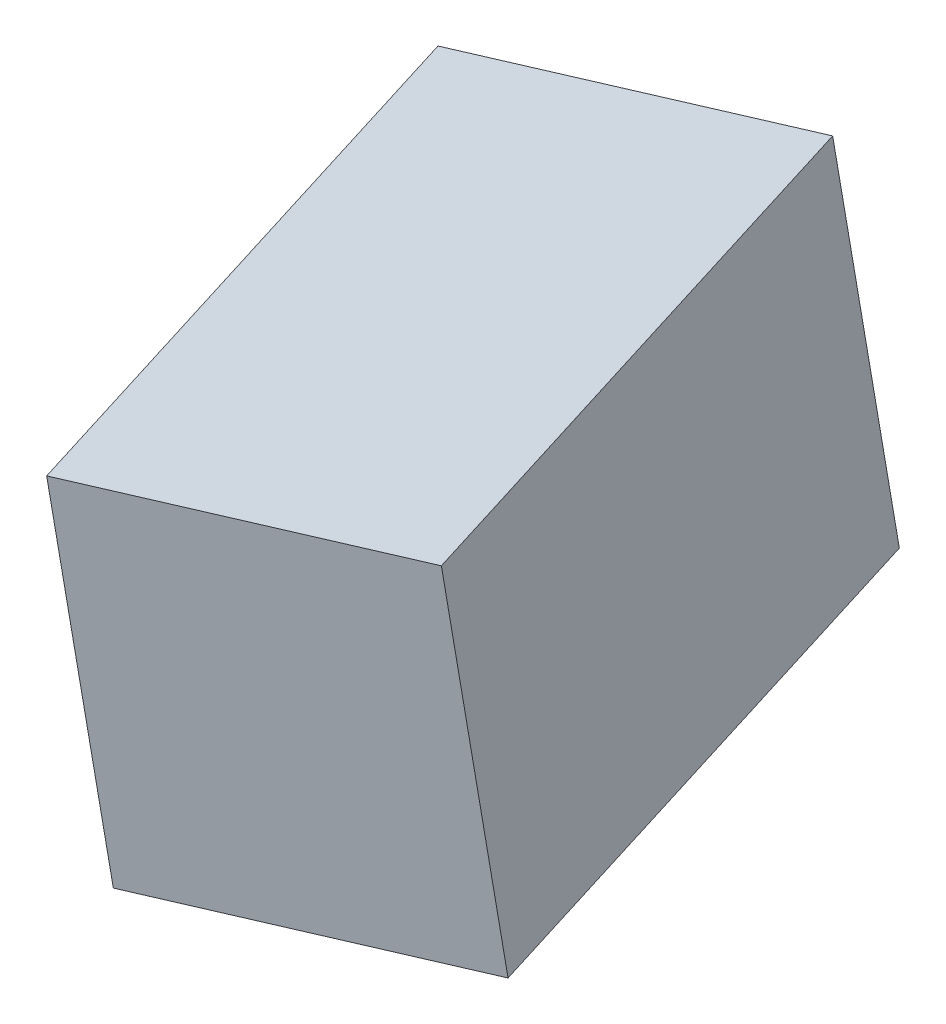
ISO-10303-21;
HEADER;
FILE_DESCRIPTION(('STEP AP214'),'2;1');
FILE_NAME('part.step','',(''),(''),'','','');
FILE_SCHEMA(('AUTOMOTIVE_DESIGN { 1 0 10303 214 1 1 1 1 }'));
ENDSEC;
DATA;
#1=APPLICATION_CONTEXT('core data for automotive mechanical design processes');
#2=APPLICATION_PROTOCOL_DEFINITION('international standard','automotive_design',2000,#1);
#3=PRODUCT_CONTEXT('',#1,'mechanical');
#4=PRODUCT('Part','Part','',(#3));
#5=PRODUCT_RELATED_PRODUCT_CATEGORY('part','',(#4));
#6=PRODUCT_DEFINITION_FORMATION('','',#4);
#7=PRODUCT_DEFINITION_CONTEXT('part definition',#1,'design');
#8=PRODUCT_DEFINITION('design','',#6,#7);
#9=PRODUCT_DEFINITION_SHAPE('','',#8);
#10=(LENGTH_UNIT() NAMED_UNIT(*) SI_UNIT(.MILLI.,.METRE.));
#11=(NAMED_UNIT(*) PLANE_ANGLE_UNIT() SI_UNIT($,.RADIAN.));
#12=(NAMED_UNIT(*) SI_UNIT($,.STERADIAN.) SOLID_ANGLE_UNIT());
#13=UNCERTAINTY_MEASURE_WITH_UNIT(LENGTH_MEASURE(1.E-05),#10,'distance_accuracy_value','');
#14=(GEOMETRIC_REPRESENTATION_CONTEXT(3) GLOBAL_UNCERTAINTY_ASSIGNED_CONTEXT((#13)) GLOBAL_UNIT_ASSIGNED_CONTEXT((#10,
#11,#12)) REPRESENTATION_CONTEXT('',''));
#15=CARTESIAN_POINT('',(0.,0.,0.));
#16=DIRECTION('',(0.,0.,1.));
#17=DIRECTION('',(1.,0.,0.));
#18=AXIS2_PLACEMENT_3D('',#15,#16,#17);
#19=CARTESIAN_POINT('',(-1947.6709022965,350.009766664915,98.4716917595155));
#20=DIRECTION('',(-0.097384757663106,0.9913004955533,0.0885411570439388));
#21=DIRECTION('',(-0.995209160420896,-0.0977687425220106,0.));
#22=AXIS2_PLACEMENT_3D('',#19,#20,#21);
#23=PLANE('',#22);
#24=DIRECTION('',(-0.258011828042799,0.0607761898211663,-0.96422826723802));
#25=VECTOR('',#24,1.);
#26=CARTESIAN_POINT('',(-1995.73195996185,344.172476568774,110.964120683516));
#27=LINE('',#26,#25);
#28=CARTESIAN_POINT('',(-1973.80095457821,339.006500433975,192.923523398748));
#29=VERTEX_POINT('',#28);
#30=CARTESIAN_POINT('',(-1995.73195996185,344.172476568774,110.964120683516));
#31=VERTEX_POINT('',#30);
#32=EDGE_CURVE('E102',#29,#31,#27,.T.);
#33=ORIENTED_EDGE('',*,*,#32,.T.);
#34=DIRECTION('',(-0.961221153307038,-0.116745801922822,0.249848578480018));
#35=VECTOR('',#34,1.);
#36=CARTESIAN_POINT('',(-1947.6709022965,350.009766664915,98.4716917595155));
#37=LINE('',#36,#35);
#38=CARTESIAN_POINT('',(-1947.6709022965,350.009766664915,98.4716917595155));
#39=VERTEX_POINT('',#38);
#40=EDGE_CURVE('E11',#39,#31,#37,.T.);
#41=ORIENTED_EDGE('',*,*,#40,.F.);
#42=DIRECTION('',(-0.258011828042799,0.0607761898211663,-0.96422826723802));
#43=VECTOR('',#42,1.);
#44=CARTESIAN_POINT('',(-1947.6709022965,350.009766664915,98.4716917595155));
#45=LINE('',#44,#43);
#46=CARTESIAN_POINT('',(-1925.73989691286,344.843790530116,180.431094474747));
#47=VERTEX_POINT('',#46);
#48=EDGE_CURVE('E90',#47,#39,#45,.T.);
#49=ORIENTED_EDGE('',*,*,#48,.F.);
#50=DIRECTION('',(-0.961221153307038,-0.116745801922822,0.249848578480018));
#51=VECTOR('',#50,1.);
#52=CARTESIAN_POINT('',(-1925.73989691286,344.843790530116,180.431094474747));
#53=LINE('',#52,#51);
#54=EDGE_CURVE('E98',#47,#29,#53,.T.);
#55=ORIENTED_EDGE('',*,*,#54,.T.);
#56=EDGE_LOOP('',(#33,#41,#49,#55));
#57=FACE_BOUND('',#56,.T.);
#58=ADVANCED_FACE('F39',(#57),#23,.F.);
#59=CARTESIAN_POINT('',(-1947.6709022965,350.009766664915,98.4716917595155));
#60=DIRECTION('',(0.258011828042799,-0.060776189821167,0.96422826723802));
#61=DIRECTION('',(0.966014022648404,0.,-0.25848966719513));
#62=AXIS2_PLACEMENT_3D('',#59,#60,#61);
#63=PLANE('',#62);
#64=DIRECTION('',(-0.0973847576631013,0.991300495553301,0.0885411570439383));
#65=VECTOR('',#64,1.);
#66=CARTESIAN_POINT('',(-1995.73195996185,344.172476568774,110.964120683516));
#67=LINE('',#66,#65);
#68=CARTESIAN_POINT('',(-2001.08812163332,398.694003824206,115.833884320933));
#69=VERTEX_POINT('',#68);
#70=EDGE_CURVE('E94',#31,#69,#67,.T.);
#71=ORIENTED_EDGE('',*,*,#70,.T.);
#72=DIRECTION('',(-0.961221153307038,-0.116745801922822,0.249848578480018));
#73=VECTOR('',#72,1.);
#74=CARTESIAN_POINT('',(-1953.02706396797,404.531293920347,103.341455396932));
#75=LINE('',#74,#73);
#76=CARTESIAN_POINT('',(-1953.02706396797,404.531293920347,103.341455396932));
#77=VERTEX_POINT('',#76);
#78=EDGE_CURVE('E47',#77,#69,#75,.T.);
#79=ORIENTED_EDGE('',*,*,#78,.F.);
#80=DIRECTION('',(-0.0973847576631013,0.991300495553301,0.0885411570439383));
#81=VECTOR('',#80,1.);
#82=CARTESIAN_POINT('',(-1947.6709022965,350.009766664915,98.4716917595155));
#83=LINE('',#82,#81);
#84=EDGE_CURVE('E85',#39,#77,#83,.T.);
#85=ORIENTED_EDGE('',*,*,#84,.F.);
#86=ORIENTED_EDGE('',*,*,#40,.T.);
#87=EDGE_LOOP('',(#71,#79,#85,#86));
#88=FACE_BOUND('',#87,.T.);
#89=ADVANCED_FACE('F93',(#88),#63,.F.);
#90=CARTESIAN_POINT('',(-1953.02706396797,404.531293920347,103.341455396932));
#91=DIRECTION('',(0.0973847576631063,-0.9913004955533,-0.0885411570439379));
#92=DIRECTION('',(0.995209160420896,0.0977687425220109,0.));
#93=AXIS2_PLACEMENT_3D('',#90,#91,#92);
#94=PLANE('',#93);
#95=DIRECTION('',(0.258011828042796,-0.0607761898211656,0.964228267238021));
#96=VECTOR('',#95,1.);
#97=CARTESIAN_POINT('',(-2001.08812163332,398.694003824206,115.833884320933));
#98=LINE('',#97,#96);
#99=CARTESIAN_POINT('',(-1979.15711624968,393.528027689407,197.793287036165));
#100=VERTEX_POINT('',#99);
#101=EDGE_CURVE('E72',#69,#100,#98,.T.);
#102=ORIENTED_EDGE('',*,*,#101,.T.);
#103=DIRECTION('',(-0.961221153307038,-0.116745801922822,0.249848578480018));
#104=VECTOR('',#103,1.);
#105=CARTESIAN_POINT('',(-1931.09605858433,399.365317785548,185.300858112164));
#106=LINE('',#105,#104);
#107=CARTESIAN_POINT('',(-1931.09605858433,399.365317785548,185.300858112164));
#108=VERTEX_POINT('',#107);
#109=EDGE_CURVE('E95',#108,#100,#106,.T.);
#110=ORIENTED_EDGE('',*,*,#109,.F.);
#111=DIRECTION('',(0.258011828042796,-0.0607761898211656,0.964228267238021));
#112=VECTOR('',#111,1.);
#113=CARTESIAN_POINT('',(-1953.02706396797,404.531293920347,103.341455396932));
#114=LINE('',#113,#112);
#115=EDGE_CURVE('E88',#77,#108,#114,.T.);
#116=ORIENTED_EDGE('',*,*,#115,.F.);
#117=ORIENTED_EDGE('',*,*,#78,.T.);
#118=EDGE_LOOP('',(#102,#110,#116,#117));
#119=FACE_BOUND('',#118,.T.);
#120=ADVANCED_FACE('F96',(#119),#94,.F.);
#121=CARTESIAN_POINT('',(-1925.73989691286,344.843790530116,180.431094474747));
#122=DIRECTION('',(-0.258011828042799,0.0607761898211666,-0.96422826723802));
#123=DIRECTION('',(-0.966014022648404,0.,0.25848966719513));
#124=AXIS2_PLACEMENT_3D('',#121,#122,#123);
#125=PLANE('',#124);
#126=DIRECTION('',(0.0973847576631052,-0.9913004955533,-0.0885411570439389));
#127=VECTOR('',#126,1.);
#128=CARTESIAN_POINT('',(-1973.80095457821,339.006500433975,192.923523398748));
#129=LINE('',#128,#127);
#130=EDGE_CURVE('E78',#100,#29,#129,.T.);
#131=ORIENTED_EDGE('',*,*,#130,.T.);
#132=ORIENTED_EDGE('',*,*,#54,.F.);
#133=DIRECTION('',(0.0973847576631052,-0.9913004955533,-0.0885411570439389));
#134=VECTOR('',#133,1.);
#135=CARTESIAN_POINT('',(-1925.73989691286,344.843790530116,180.431094474747));
#136=LINE('',#135,#134);
#137=EDGE_CURVE('E55',#108,#47,#136,.T.);
#138=ORIENTED_EDGE('',*,*,#137,.F.);
#139=ORIENTED_EDGE('',*,*,#109,.T.);
#140=EDGE_LOOP('',(#131,#132,#138,#139));
#141=FACE_BOUND('',#140,.T.);
#142=ADVANCED_FACE('F109',(#141),#125,.F.);
#143=CARTESIAN_POINT('',(-1783.91429783741,-216.666585567839,463.689807399076));
#144=DIRECTION('',(-0.961221153307038,-0.116745801922822,0.249848578480018));
#145=DIRECTION('',(0.25156884939803,0.,0.967839405073254));
#146=AXIS2_PLACEMENT_3D('',#143,#144,#145);
#147=PLANE('',#146);
#148=ORIENTED_EDGE('',*,*,#48,.T.);
#149=ORIENTED_EDGE('',*,*,#84,.T.);
#150=ORIENTED_EDGE('',*,*,#115,.T.);
#151=ORIENTED_EDGE('',*,*,#137,.T.);
#152=EDGE_LOOP('',(#148,#149,#150,#151));
#153=FACE_BOUND('',#152,.T.);
#154=ADVANCED_FACE('F86',(#153),#147,.F.);
#155=CARTESIAN_POINT('',(-1831.97535550276,-222.50387566398,476.182236323077));
#156=DIRECTION('',(-0.961221153307038,-0.116745801922822,0.249848578480018));
#157=DIRECTION('',(0.25156884939803,0.,0.967839405073254));
#158=AXIS2_PLACEMENT_3D('',#155,#156,#157);
#159=PLANE('',#158);
#160=ORIENTED_EDGE('',*,*,#32,.F.);
#161=ORIENTED_EDGE('',*,*,#130,.F.);
#162=ORIENTED_EDGE('',*,*,#101,.F.);
#163=ORIENTED_EDGE('',*,*,#70,.F.);
#164=EDGE_LOOP('',(#160,#161,#162,#163));
#165=FACE_BOUND('',#164,.T.);
#166=ADVANCED_FACE('F112',(#165),#159,.T.);
#167=CLOSED_SHELL('',(#58,#89,#120,#142,#154,#166));
#168=MANIFOLD_SOLID_BREP('B2',#167);
#169=ADVANCED_BREP_SHAPE_REPRESENTATION('',(#18,#168),#14);
#170=SHAPE_DEFINITION_REPRESENTATION(#9,#169);
ENDSEC;
END-ISO-10303-21;
